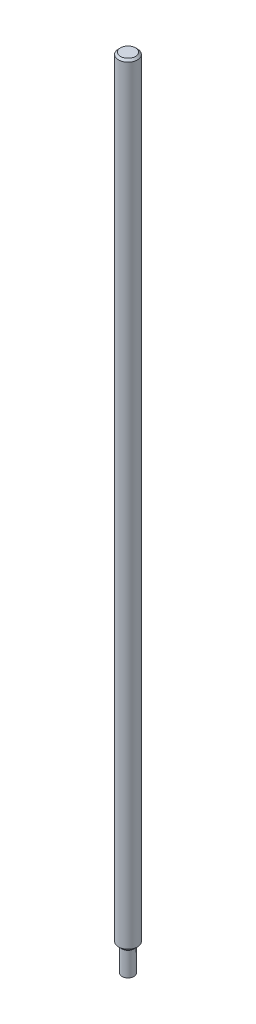
ISO-10303-21;
HEADER;
FILE_DESCRIPTION(('STEP AP214'),'2;1');
FILE_NAME('part.step','',(''),(''),'','','');
FILE_SCHEMA(('AUTOMOTIVE_DESIGN { 1 0 10303 214 1 1 1 1 }'));
ENDSEC;
DATA;
#1=APPLICATION_CONTEXT('core data for automotive mechanical design processes');
#2=APPLICATION_PROTOCOL_DEFINITION('international standard','automotive_design',2000,#1);
#3=PRODUCT_CONTEXT('',#1,'mechanical');
#4=PRODUCT('Part','Part','',(#3));
#5=PRODUCT_RELATED_PRODUCT_CATEGORY('part','',(#4));
#6=PRODUCT_DEFINITION_FORMATION('','',#4);
#7=PRODUCT_DEFINITION_CONTEXT('part definition',#1,'design');
#8=PRODUCT_DEFINITION('design','',#6,#7);
#9=PRODUCT_DEFINITION_SHAPE('','',#8);
#10=(LENGTH_UNIT() NAMED_UNIT(*) SI_UNIT(.MILLI.,.METRE.));
#11=(NAMED_UNIT(*) PLANE_ANGLE_UNIT() SI_UNIT($,.RADIAN.));
#12=(NAMED_UNIT(*) SI_UNIT($,.STERADIAN.) SOLID_ANGLE_UNIT());
#13=UNCERTAINTY_MEASURE_WITH_UNIT(LENGTH_MEASURE(1.E-05),#10,'distance_accuracy_value','');
#14=(GEOMETRIC_REPRESENTATION_CONTEXT(3) GLOBAL_UNCERTAINTY_ASSIGNED_CONTEXT((#13)) GLOBAL_UNIT_ASSIGNED_CONTEXT((#10,
#11,#12)) REPRESENTATION_CONTEXT('',''));
#15=CARTESIAN_POINT('',(0.,0.,0.));
#16=DIRECTION('',(0.,0.,1.));
#17=DIRECTION('',(1.,0.,0.));
#18=AXIS2_PLACEMENT_3D('',#15,#16,#17);
#19=CARTESIAN_POINT('',(0.,100.,2.38000000000003));
#20=DIRECTION('',(0.,1.,0.));
#21=DIRECTION('',(0.,0.,1.));
#22=AXIS2_PLACEMENT_3D('',#19,#20,#21);
#23=PLANE('',#22);
#24=CARTESIAN_POINT('',(0.,100.,0.));
#25=DIRECTION('',(0.,1.,0.));
#26=DIRECTION('',(0.,0.,1.));
#27=AXIS2_PLACEMENT_3D('',#24,#25,#26);
#28=CIRCLE('',#27,1.87999999999996);
#29=CARTESIAN_POINT('',(0.,100.,1.88));
#30=VERTEX_POINT('',#29);
#31=EDGE_CURVE('E42',#30,#30,#28,.T.);
#32=ORIENTED_EDGE('',*,*,#31,.T.);
#33=EDGE_LOOP('',(#32));
#34=FACE_BOUND('',#33,.T.);
#35=ADVANCED_FACE('F34',(#34),#23,.T.);
#36=CARTESIAN_POINT('',(0.,-100.,0.));
#37=DIRECTION('',(0.,-1.,0.));
#38=DIRECTION('',(0.,0.,-1.));
#39=AXIS2_PLACEMENT_3D('',#36,#37,#38);
#40=PLANE('',#39);
#41=CARTESIAN_POINT('',(0.,-100.,0.));
#42=DIRECTION('',(0.,1.,0.));
#43=DIRECTION('',(0.,0.,1.));
#44=AXIS2_PLACEMENT_3D('',#41,#42,#43);
#45=CIRCLE('',#44,1.5);
#46=CARTESIAN_POINT('',(0.,-100.,1.49999999999997));
#47=VERTEX_POINT('',#46);
#48=EDGE_CURVE('E46',#47,#47,#45,.T.);
#49=ORIENTED_EDGE('',*,*,#48,.F.);
#50=EDGE_LOOP('',(#49));
#51=FACE_BOUND('',#50,.T.);
#52=ADVANCED_FACE('F71',(#51),#40,.T.);
#53=CARTESIAN_POINT('',(0.,100.,0.));
#54=DIRECTION('',(0.,1.,0.));
#55=DIRECTION('',(0.,0.,1.));
#56=AXIS2_PLACEMENT_3D('',#53,#54,#55);
#57=CYLINDRICAL_SURFACE('',#56,1.5);
#58=ORIENTED_EDGE('',*,*,#48,.T.);
#59=EDGE_LOOP('',(#58));
#60=FACE_BOUND('',#59,.T.);
#61=CARTESIAN_POINT('',(0.,-94.,0.));
#62=DIRECTION('',(0.,1.,0.));
#63=DIRECTION('',(0.,0.,1.));
#64=AXIS2_PLACEMENT_3D('',#61,#62,#63);
#65=CIRCLE('',#64,1.5);
#66=CARTESIAN_POINT('',(0.,-94.,1.49999999999997));
#67=VERTEX_POINT('',#66);
#68=EDGE_CURVE('E50',#67,#67,#65,.T.);
#69=ORIENTED_EDGE('',*,*,#68,.F.);
#70=EDGE_LOOP('',(#69));
#71=FACE_BOUND('',#70,.T.);
#72=ADVANCED_FACE('F63',(#60,#71),#57,.T.);
#73=CARTESIAN_POINT('',(0.,-93.1199999999999,0.));
#74=DIRECTION('',(0.,1.,0.));
#75=DIRECTION('',(0.,0.,1.));
#76=AXIS2_PLACEMENT_3D('',#73,#74,#75);
#77=CONICAL_SURFACE('',#76,2.38000000000006,0.785398163397442);
#78=ORIENTED_EDGE('',*,*,#68,.T.);
#79=EDGE_LOOP('',(#78));
#80=FACE_BOUND('',#79,.T.);
#81=CARTESIAN_POINT('',(0.,-93.1199999999999,0.));
#82=DIRECTION('',(0.,1.,0.));
#83=DIRECTION('',(0.,0.,1.));
#84=AXIS2_PLACEMENT_3D('',#81,#82,#83);
#85=CIRCLE('',#84,2.38000000000006);
#86=CARTESIAN_POINT('',(0.,-93.1199999999999,2.38000000000003));
#87=VERTEX_POINT('',#86);
#88=EDGE_CURVE('E55',#87,#87,#85,.T.);
#89=ORIENTED_EDGE('',*,*,#88,.F.);
#90=EDGE_LOOP('',(#89));
#91=FACE_BOUND('',#90,.T.);
#92=ADVANCED_FACE('F61',(#80,#91),#77,.T.);
#93=CARTESIAN_POINT('',(0.,100.,0.));
#94=DIRECTION('',(0.,1.,0.));
#95=DIRECTION('',(0.,0.,1.));
#96=AXIS2_PLACEMENT_3D('',#93,#94,#95);
#97=CYLINDRICAL_SURFACE('',#96,2.38000000000003);
#98=CARTESIAN_POINT('',(0.,99.4999999999999,0.));
#99=DIRECTION('',(0.,1.,0.));
#100=DIRECTION('',(0.,0.,1.));
#101=AXIS2_PLACEMENT_3D('',#98,#99,#100);
#102=CIRCLE('',#101,2.38000000000003);
#103=CARTESIAN_POINT('',(0.,99.4999999999999,2.38000000000007));
#104=VERTEX_POINT('',#103);
#105=EDGE_CURVE('E10',#104,#104,#102,.F.);
#106=ORIENTED_EDGE('',*,*,#105,.T.);
#107=EDGE_LOOP('',(#106));
#108=FACE_BOUND('',#107,.T.);
#109=ORIENTED_EDGE('',*,*,#88,.T.);
#110=EDGE_LOOP('',(#109));
#111=FACE_BOUND('',#110,.T.);
#112=ADVANCED_FACE('F59',(#108,#111),#97,.T.);
#113=CARTESIAN_POINT('',(0.,100.,0.));
#114=DIRECTION('',(0.,-1.,0.));
#115=DIRECTION('',(0.,0.,-1.));
#116=AXIS2_PLACEMENT_3D('',#113,#114,#115);
#117=CONICAL_SURFACE('',#116,1.87999999999996,0.785398163397445);
#118=ORIENTED_EDGE('',*,*,#105,.F.);
#119=EDGE_LOOP('',(#118));
#120=FACE_BOUND('',#119,.T.);
#121=ORIENTED_EDGE('',*,*,#31,.F.);
#122=EDGE_LOOP('',(#121));
#123=FACE_BOUND('',#122,.T.);
#124=ADVANCED_FACE('F37',(#120,#123),#117,.T.);
#125=CLOSED_SHELL('',(#35,#52,#72,#92,#112,#124));
#126=MANIFOLD_SOLID_BREP('B2',#125);
#127=ADVANCED_BREP_SHAPE_REPRESENTATION('',(#18,#126),#14);
#128=SHAPE_DEFINITION_REPRESENTATION(#9,#127);
ENDSEC;
END-ISO-10303-21;
